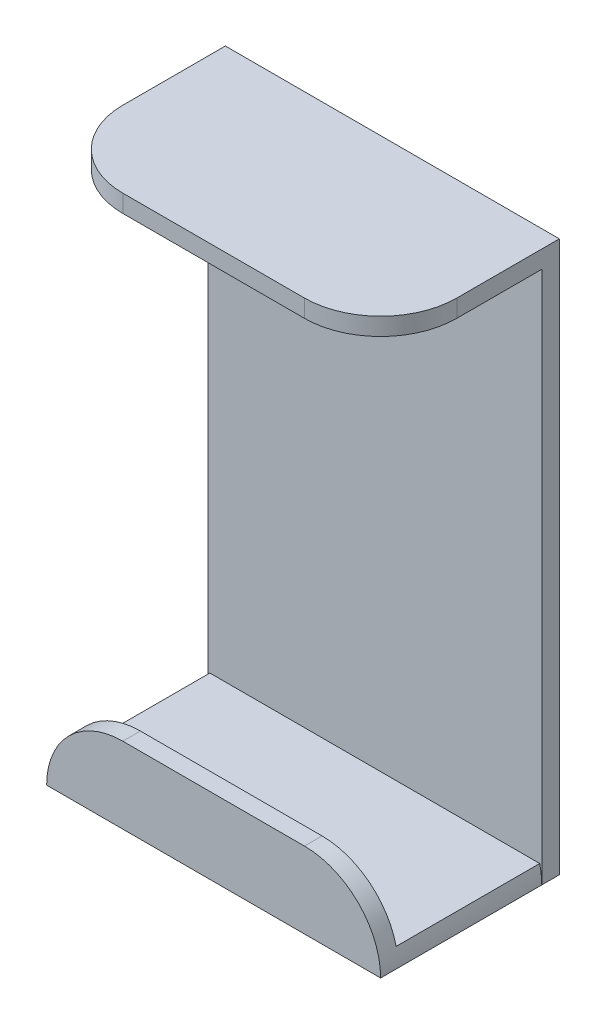
ISO-10303-21;
HEADER;
FILE_DESCRIPTION(('STEP AP214'),'2;1');
FILE_NAME('part.step','',(''),(''),'','','');
FILE_SCHEMA(('AUTOMOTIVE_DESIGN { 1 0 10303 214 1 1 1 1 }'));
ENDSEC;
DATA;
#1=APPLICATION_CONTEXT('core data for automotive mechanical design processes');
#2=APPLICATION_PROTOCOL_DEFINITION('international standard','automotive_design',2000,#1);
#3=PRODUCT_CONTEXT('',#1,'mechanical');
#4=PRODUCT('Part','Part','',(#3));
#5=PRODUCT_RELATED_PRODUCT_CATEGORY('part','',(#4));
#6=PRODUCT_DEFINITION_FORMATION('','',#4);
#7=PRODUCT_DEFINITION_CONTEXT('part definition',#1,'design');
#8=PRODUCT_DEFINITION('design','',#6,#7);
#9=PRODUCT_DEFINITION_SHAPE('','',#8);
#10=(LENGTH_UNIT() NAMED_UNIT(*) SI_UNIT(.MILLI.,.METRE.));
#11=(NAMED_UNIT(*) PLANE_ANGLE_UNIT() SI_UNIT($,.RADIAN.));
#12=(NAMED_UNIT(*) SI_UNIT($,.STERADIAN.) SOLID_ANGLE_UNIT());
#13=UNCERTAINTY_MEASURE_WITH_UNIT(LENGTH_MEASURE(1.E-05),#10,'distance_accuracy_value','');
#14=(GEOMETRIC_REPRESENTATION_CONTEXT(3) GLOBAL_UNCERTAINTY_ASSIGNED_CONTEXT((#13)) GLOBAL_UNIT_ASSIGNED_CONTEXT((#10,
#11,#12)) REPRESENTATION_CONTEXT('',''));
#15=CARTESIAN_POINT('',(0.,0.,0.));
#16=DIRECTION('',(0.,0.,1.));
#17=DIRECTION('',(1.,0.,0.));
#18=AXIS2_PLACEMENT_3D('',#15,#16,#17);
#19=CARTESIAN_POINT('',(57.,100.,0.));
#20=DIRECTION('',(0.,0.,-1.));
#21=DIRECTION('',(-1.,0.,0.));
#22=AXIS2_PLACEMENT_3D('',#19,#20,#21);
#23=PLANE('',#22);
#24=DIRECTION('',(-1.,0.,0.));
#25=VECTOR('',#24,1.);
#26=CARTESIAN_POINT('',(206.850185602154,97.,0.));
#27=LINE('',#26,#25);
#28=CARTESIAN_POINT('',(44.,97.,0.));
#29=VERTEX_POINT('',#28);
#30=CARTESIAN_POINT('',(13.,97.,0.));
#31=VERTEX_POINT('',#30);
#32=EDGE_CURVE('E191',#29,#31,#27,.T.);
#33=ORIENTED_EDGE('',*,*,#32,.T.);
#34=DIRECTION('',(0.,-1.,0.));
#35=VECTOR('',#34,1.);
#36=CARTESIAN_POINT('',(13.,100.,0.));
#37=LINE('',#36,#35);
#38=CARTESIAN_POINT('',(13.,94.,0.));
#39=VERTEX_POINT('',#38);
#40=EDGE_CURVE('E227',#31,#39,#37,.T.);
#41=ORIENTED_EDGE('',*,*,#40,.T.);
#42=DIRECTION('',(1.,0.,0.));
#43=VECTOR('',#42,1.);
#44=CARTESIAN_POINT('',(-43.,94.,0.));
#45=LINE('',#44,#43);
#46=CARTESIAN_POINT('',(44.,94.,0.));
#47=VERTEX_POINT('',#46);
#48=EDGE_CURVE('E144',#39,#47,#45,.T.);
#49=ORIENTED_EDGE('',*,*,#48,.T.);
#50=DIRECTION('',(0.,-1.,0.));
#51=VECTOR('',#50,1.);
#52=CARTESIAN_POINT('',(44.,100.,0.));
#53=LINE('',#52,#51);
#54=EDGE_CURVE('E224',#47,#29,#53,.F.);
#55=ORIENTED_EDGE('',*,*,#54,.T.);
#56=EDGE_LOOP('',(#33,#41,#49,#55));
#57=FACE_BOUND('',#56,.T.);
#58=ADVANCED_FACE('F39',(#57),#23,.F.);
#59=CARTESIAN_POINT('',(206.850185602154,97.,0.));
#60=DIRECTION('',(0.,1.,0.));
#61=DIRECTION('',(0.,0.,1.));
#62=AXIS2_PLACEMENT_3D('',#59,#60,#61);
#63=PLANE('',#62);
#64=DIRECTION('',(0.,0.,1.));
#65=VECTOR('',#64,1.);
#66=CARTESIAN_POINT('',(0.,97.,0.));
#67=LINE('',#66,#65);
#68=CARTESIAN_POINT('',(0.,97.,-30.5));
#69=VERTEX_POINT('',#68);
#70=CARTESIAN_POINT('',(0.,97.,-13.));
#71=VERTEX_POINT('',#70);
#72=EDGE_CURVE('E215',#69,#71,#67,.T.);
#73=ORIENTED_EDGE('',*,*,#72,.T.);
#74=CARTESIAN_POINT('',(13.,97.,-13.));
#75=DIRECTION('',(0.,1.,0.));
#76=DIRECTION('',(0.,0.,1.));
#77=AXIS2_PLACEMENT_3D('',#74,#75,#76);
#78=CIRCLE('',#77,13.);
#79=EDGE_CURVE('E243',#71,#31,#78,.T.);
#80=ORIENTED_EDGE('',*,*,#79,.T.);
#81=ORIENTED_EDGE('',*,*,#32,.F.);
#82=CARTESIAN_POINT('',(44.,97.,-13.));
#83=DIRECTION('',(0.,1.,0.));
#84=DIRECTION('',(0.,0.,1.));
#85=AXIS2_PLACEMENT_3D('',#82,#83,#84);
#86=CIRCLE('',#85,13.);
#87=CARTESIAN_POINT('',(57.,97.,-13.));
#88=VERTEX_POINT('',#87);
#89=EDGE_CURVE('E240',#29,#88,#86,.T.);
#90=ORIENTED_EDGE('',*,*,#89,.T.);
#91=DIRECTION('',(0.,0.,-1.));
#92=VECTOR('',#91,1.);
#93=CARTESIAN_POINT('',(57.,97.,-33.5));
#94=LINE('',#93,#92);
#95=CARTESIAN_POINT('',(57.,97.,-30.5));
#96=VERTEX_POINT('',#95);
#97=EDGE_CURVE('E203',#88,#96,#94,.T.);
#98=ORIENTED_EDGE('',*,*,#97,.T.);
#99=DIRECTION('',(-1.,0.,0.));
#100=VECTOR('',#99,1.);
#101=CARTESIAN_POINT('',(206.850185602154,97.,-30.5));
#102=LINE('',#101,#100);
#103=EDGE_CURVE('E184',#96,#69,#102,.T.);
#104=ORIENTED_EDGE('',*,*,#103,.T.);
#105=EDGE_LOOP('',(#73,#80,#81,#90,#98,#104));
#106=FACE_BOUND('',#105,.T.);
#107=ADVANCED_FACE('F318',(#106),#63,.T.);
#108=CARTESIAN_POINT('',(206.850185602154,97.,-30.5));
#109=DIRECTION('',(0.,0.,-1.));
#110=DIRECTION('',(0.,1.,0.));
#111=AXIS2_PLACEMENT_3D('',#108,#109,#110);
#112=PLANE('',#111);
#113=ORIENTED_EDGE('',*,*,#103,.F.);
#114=DIRECTION('',(0.,-1.,0.));
#115=VECTOR('',#114,1.);
#116=CARTESIAN_POINT('',(57.,100.,-30.5));
#117=LINE('',#116,#115);
#118=CARTESIAN_POINT('',(57.,3.,-30.5));
#119=VERTEX_POINT('',#118);
#120=EDGE_CURVE('E199',#96,#119,#117,.T.);
#121=ORIENTED_EDGE('',*,*,#120,.T.);
#122=DIRECTION('',(-1.,0.,0.));
#123=VECTOR('',#122,1.);
#124=CARTESIAN_POINT('',(206.850185602154,3.,-30.5));
#125=LINE('',#124,#123);
#126=CARTESIAN_POINT('',(0.,3.,-30.5));
#127=VERTEX_POINT('',#126);
#128=EDGE_CURVE('E170',#119,#127,#125,.T.);
#129=ORIENTED_EDGE('',*,*,#128,.T.);
#130=DIRECTION('',(0.,1.,0.));
#131=VECTOR('',#130,1.);
#132=CARTESIAN_POINT('',(0.,100.,-30.5));
#133=LINE('',#132,#131);
#134=EDGE_CURVE('E211',#127,#69,#133,.T.);
#135=ORIENTED_EDGE('',*,*,#134,.T.);
#136=EDGE_LOOP('',(#113,#121,#129,#135));
#137=FACE_BOUND('',#136,.T.);
#138=ADVANCED_FACE('F304',(#137),#112,.T.);
#139=CARTESIAN_POINT('',(206.850185602154,3.,-30.5));
#140=DIRECTION('',(0.,-1.,0.));
#141=DIRECTION('',(0.,0.,-1.));
#142=AXIS2_PLACEMENT_3D('',#139,#140,#141);
#143=PLANE('',#142);
#144=ORIENTED_EDGE('',*,*,#128,.F.);
#145=DIRECTION('',(0.,0.,1.));
#146=VECTOR('',#145,1.);
#147=CARTESIAN_POINT('',(57.,3.,-33.5));
#148=LINE('',#147,#146);
#149=CARTESIAN_POINT('',(57.,3.,-27.5));
#150=VERTEX_POINT('',#149);
#151=EDGE_CURVE('E196',#119,#150,#148,.T.);
#152=ORIENTED_EDGE('',*,*,#151,.T.);
#153=CARTESIAN_POINT('',(57.,3.,0.));
#154=VERTEX_POINT('',#153);
#155=EDGE_CURVE('E195',#150,#154,#148,.T.);
#156=ORIENTED_EDGE('',*,*,#155,.T.);
#157=DIRECTION('',(-1.,0.,0.));
#158=VECTOR('',#157,1.);
#159=CARTESIAN_POINT('',(206.850185602154,3.,0.));
#160=LINE('',#159,#158);
#161=CARTESIAN_POINT('',(0.,3.,0.));
#162=VERTEX_POINT('',#161);
#163=EDGE_CURVE('E180',#154,#162,#160,.T.);
#164=ORIENTED_EDGE('',*,*,#163,.T.);
#165=DIRECTION('',(0.,0.,-1.));
#166=VECTOR('',#165,1.);
#167=CARTESIAN_POINT('',(0.,3.,0.));
#168=LINE('',#167,#166);
#169=CARTESIAN_POINT('',(0.,3.,-27.5));
#170=VERTEX_POINT('',#169);
#171=EDGE_CURVE('E207',#162,#170,#168,.T.);
#172=ORIENTED_EDGE('',*,*,#171,.T.);
#173=EDGE_CURVE('E206',#170,#127,#168,.T.);
#174=ORIENTED_EDGE('',*,*,#173,.T.);
#175=EDGE_LOOP('',(#144,#152,#156,#164,#172,#174));
#176=FACE_BOUND('',#175,.T.);
#177=ADVANCED_FACE('F278',(#176),#143,.T.);
#178=ORIENTED_EDGE('',*,*,#163,.F.);
#179=CARTESIAN_POINT('',(44.,3.,0.));
#180=DIRECTION('',(0.,0.,-1.));
#181=DIRECTION('',(-1.,0.,0.));
#182=AXIS2_PLACEMENT_3D('',#179,#180,#181);
#183=CIRCLE('',#182,13.);
#184=CARTESIAN_POINT('',(44.,16.,0.));
#185=VERTEX_POINT('',#184);
#186=EDGE_CURVE('E269',#154,#185,#183,.F.);
#187=ORIENTED_EDGE('',*,*,#186,.T.);
#188=DIRECTION('',(1.,0.,0.));
#189=VECTOR('',#188,1.);
#190=CARTESIAN_POINT('',(-43.,16.,0.));
#191=LINE('',#190,#189);
#192=CARTESIAN_POINT('',(13.,16.,0.));
#193=VERTEX_POINT('',#192);
#194=EDGE_CURVE('E161',#193,#185,#191,.T.);
#195=ORIENTED_EDGE('',*,*,#194,.F.);
#196=CARTESIAN_POINT('',(13.,3.,0.));
#197=DIRECTION('',(0.,0.,-1.));
#198=DIRECTION('',(-1.,0.,0.));
#199=AXIS2_PLACEMENT_3D('',#196,#197,#198);
#200=CIRCLE('',#199,13.);
#201=EDGE_CURVE('E266',#193,#162,#200,.F.);
#202=ORIENTED_EDGE('',*,*,#201,.T.);
#203=EDGE_LOOP('',(#178,#187,#195,#202));
#204=FACE_BOUND('',#203,.T.);
#205=ADVANCED_FACE('F283',(#204),#23,.F.);
#206=CARTESIAN_POINT('',(57.,100.,-33.5));
#207=DIRECTION('',(-1.,0.,0.));
#208=DIRECTION('',(0.,0.,1.));
#209=AXIS2_PLACEMENT_3D('',#206,#207,#208);
#210=PLANE('',#209);
#211=ORIENTED_EDGE('',*,*,#97,.F.);
#212=DIRECTION('',(0.,-1.,0.));
#213=VECTOR('',#212,1.);
#214=CARTESIAN_POINT('',(57.,100.,-13.));
#215=LINE('',#214,#213);
#216=CARTESIAN_POINT('',(57.,94.,-13.));
#217=VERTEX_POINT('',#216);
#218=EDGE_CURVE('E159',#88,#217,#215,.T.);
#219=ORIENTED_EDGE('',*,*,#218,.T.);
#220=DIRECTION('',(0.,0.,1.));
#221=VECTOR('',#220,1.);
#222=CARTESIAN_POINT('',(57.,94.,0.));
#223=LINE('',#222,#221);
#224=CARTESIAN_POINT('',(57.,94.,-27.5));
#225=VERTEX_POINT('',#224);
#226=EDGE_CURVE('E139',#225,#217,#223,.T.);
#227=ORIENTED_EDGE('',*,*,#226,.F.);
#228=DIRECTION('',(0.,1.,0.));
#229=VECTOR('',#228,1.);
#230=CARTESIAN_POINT('',(57.,94.,-27.5));
#231=LINE('',#230,#229);
#232=EDGE_CURVE('E148',#150,#225,#231,.T.);
#233=ORIENTED_EDGE('',*,*,#232,.F.);
#234=ORIENTED_EDGE('',*,*,#151,.F.);
#235=ORIENTED_EDGE('',*,*,#120,.F.);
#236=EDGE_LOOP('',(#211,#219,#227,#233,#234,#235));
#237=FACE_BOUND('',#236,.T.);
#238=ADVANCED_FACE('F157',(#237),#210,.F.);
#239=CARTESIAN_POINT('',(0.,100.,0.));
#240=DIRECTION('',(1.,0.,0.));
#241=DIRECTION('',(0.,0.,-1.));
#242=AXIS2_PLACEMENT_3D('',#239,#240,#241);
#243=PLANE('',#242);
#244=DIRECTION('',(0.,0.,1.));
#245=VECTOR('',#244,1.);
#246=CARTESIAN_POINT('',(0.,94.,0.));
#247=LINE('',#246,#245);
#248=CARTESIAN_POINT('',(0.,94.,-27.5));
#249=VERTEX_POINT('',#248);
#250=CARTESIAN_POINT('',(0.,94.,-13.));
#251=VERTEX_POINT('',#250);
#252=EDGE_CURVE('E141',#249,#251,#247,.T.);
#253=ORIENTED_EDGE('',*,*,#252,.T.);
#254=DIRECTION('',(0.,-1.,0.));
#255=VECTOR('',#254,1.);
#256=CARTESIAN_POINT('',(0.,100.,-13.));
#257=LINE('',#256,#255);
#258=EDGE_CURVE('E237',#251,#71,#257,.F.);
#259=ORIENTED_EDGE('',*,*,#258,.T.);
#260=ORIENTED_EDGE('',*,*,#72,.F.);
#261=ORIENTED_EDGE('',*,*,#134,.F.);
#262=ORIENTED_EDGE('',*,*,#173,.F.);
#263=DIRECTION('',(0.,1.,0.));
#264=VECTOR('',#263,1.);
#265=CARTESIAN_POINT('',(0.,100.,-27.5));
#266=LINE('',#265,#264);
#267=EDGE_CURVE('E219',#170,#249,#266,.T.);
#268=ORIENTED_EDGE('',*,*,#267,.T.);
#269=EDGE_LOOP('',(#253,#259,#260,#261,#262,#268));
#270=FACE_BOUND('',#269,.T.);
#271=ADVANCED_FACE('F301',(#270),#243,.F.);
#272=CARTESIAN_POINT('',(-43.,94.,0.));
#273=DIRECTION('',(0.,1.,0.));
#274=DIRECTION('',(0.,0.,1.));
#275=AXIS2_PLACEMENT_3D('',#272,#273,#274);
#276=PLANE('',#275);
#277=ORIENTED_EDGE('',*,*,#48,.F.);
#278=CARTESIAN_POINT('',(13.,94.,-13.));
#279=DIRECTION('',(0.,1.,0.));
#280=DIRECTION('',(0.,0.,1.));
#281=AXIS2_PLACEMENT_3D('',#278,#279,#280);
#282=CIRCLE('',#281,13.);
#283=EDGE_CURVE('E234',#39,#251,#282,.F.);
#284=ORIENTED_EDGE('',*,*,#283,.T.);
#285=ORIENTED_EDGE('',*,*,#252,.F.);
#286=DIRECTION('',(1.,0.,0.));
#287=VECTOR('',#286,1.);
#288=CARTESIAN_POINT('',(-43.,94.,-27.5));
#289=LINE('',#288,#287);
#290=EDGE_CURVE('E134',#249,#225,#289,.T.);
#291=ORIENTED_EDGE('',*,*,#290,.T.);
#292=ORIENTED_EDGE('',*,*,#226,.T.);
#293=CARTESIAN_POINT('',(44.,94.,-13.));
#294=DIRECTION('',(0.,1.,0.));
#295=DIRECTION('',(0.,0.,1.));
#296=AXIS2_PLACEMENT_3D('',#293,#294,#295);
#297=CIRCLE('',#296,13.);
#298=EDGE_CURVE('E231',#217,#47,#297,.F.);
#299=ORIENTED_EDGE('',*,*,#298,.T.);
#300=EDGE_LOOP('',(#277,#284,#285,#291,#292,#299));
#301=FACE_BOUND('',#300,.T.);
#302=ADVANCED_FACE('F137',(#301),#276,.F.);
#303=CARTESIAN_POINT('',(-43.,94.,-27.5));
#304=DIRECTION('',(0.,0.,-1.));
#305=DIRECTION('',(0.,1.,0.));
#306=AXIS2_PLACEMENT_3D('',#303,#304,#305);
#307=PLANE('',#306);
#308=ORIENTED_EDGE('',*,*,#267,.F.);
#309=CARTESIAN_POINT('',(13.,3.,-27.5));
#310=DIRECTION('',(0.,0.,-1.));
#311=DIRECTION('',(0.,1.,0.));
#312=AXIS2_PLACEMENT_3D('',#309,#310,#311);
#313=CIRCLE('',#312,13.);
#314=CARTESIAN_POINT('',(0.350889359326478,6.,-27.5));
#315=VERTEX_POINT('',#314);
#316=EDGE_CURVE('E11',#170,#315,#313,.T.);
#317=ORIENTED_EDGE('',*,*,#316,.T.);
#318=DIRECTION('',(1.,0.,0.));
#319=VECTOR('',#318,1.);
#320=CARTESIAN_POINT('',(-43.,6.,-27.5));
#321=LINE('',#320,#319);
#322=CARTESIAN_POINT('',(56.6491106406735,6.,-27.5));
#323=VERTEX_POINT('',#322);
#324=EDGE_CURVE('E145',#315,#323,#321,.T.);
#325=ORIENTED_EDGE('',*,*,#324,.T.);
#326=CARTESIAN_POINT('',(44.,3.,-27.5));
#327=DIRECTION('',(0.,0.,-1.));
#328=DIRECTION('',(0.,1.,0.));
#329=AXIS2_PLACEMENT_3D('',#326,#327,#328);
#330=CIRCLE('',#329,13.);
#331=EDGE_CURVE('E48',#323,#150,#330,.T.);
#332=ORIENTED_EDGE('',*,*,#331,.T.);
#333=ORIENTED_EDGE('',*,*,#232,.T.);
#334=ORIENTED_EDGE('',*,*,#290,.F.);
#335=EDGE_LOOP('',(#308,#317,#325,#332,#333,#334));
#336=FACE_BOUND('',#335,.T.);
#337=ADVANCED_FACE('F149',(#336),#307,.F.);
#338=CARTESIAN_POINT('',(-43.,6.,-27.5));
#339=DIRECTION('',(0.,-1.,0.));
#340=DIRECTION('',(0.,0.,-1.));
#341=AXIS2_PLACEMENT_3D('',#338,#339,#340);
#342=PLANE('',#341);
#343=DIRECTION('',(1.,0.,0.));
#344=VECTOR('',#343,1.);
#345=CARTESIAN_POINT('',(-43.,6.00000000000001,-3.));
#346=LINE('',#345,#344);
#347=CARTESIAN_POINT('',(0.350889359326482,6.00000000000001,-3.));
#348=VERTEX_POINT('',#347);
#349=CARTESIAN_POINT('',(56.6491106406735,6.00000000000001,-3.));
#350=VERTEX_POINT('',#349);
#351=EDGE_CURVE('E174',#348,#350,#346,.T.);
#352=ORIENTED_EDGE('',*,*,#351,.T.);
#353=DIRECTION('',(0.,0.,-1.));
#354=VECTOR('',#353,1.);
#355=CARTESIAN_POINT('',(56.6491106406735,6.00000000000001,-3.));
#356=LINE('',#355,#354);
#357=EDGE_CURVE('E55',#350,#323,#356,.T.);
#358=ORIENTED_EDGE('',*,*,#357,.T.);
#359=ORIENTED_EDGE('',*,*,#324,.F.);
#360=DIRECTION('',(0.,0.,-1.));
#361=VECTOR('',#360,1.);
#362=CARTESIAN_POINT('',(0.35088935932648,6.,-27.5));
#363=LINE('',#362,#361);
#364=EDGE_CURVE('E261',#315,#348,#363,.F.);
#365=ORIENTED_EDGE('',*,*,#364,.T.);
#366=EDGE_LOOP('',(#352,#358,#359,#365));
#367=FACE_BOUND('',#366,.T.);
#368=ADVANCED_FACE('F376',(#367),#342,.F.);
#369=CARTESIAN_POINT('',(-43.,6.00000000000001,-3.));
#370=DIRECTION('',(0.,0.,1.));
#371=DIRECTION('',(1.,0.,0.));
#372=AXIS2_PLACEMENT_3D('',#369,#370,#371);
#373=PLANE('',#372);
#374=DIRECTION('',(1.,0.,0.));
#375=VECTOR('',#374,1.);
#376=CARTESIAN_POINT('',(-43.,16.,-3.));
#377=LINE('',#376,#375);
#378=CARTESIAN_POINT('',(13.,16.,-3.));
#379=VERTEX_POINT('',#378);
#380=CARTESIAN_POINT('',(44.,16.,-3.));
#381=VERTEX_POINT('',#380);
#382=EDGE_CURVE('E165',#379,#381,#377,.T.);
#383=ORIENTED_EDGE('',*,*,#382,.T.);
#384=CARTESIAN_POINT('',(44.,3.,-3.));
#385=DIRECTION('',(0.,0.,1.));
#386=DIRECTION('',(1.,0.,0.));
#387=AXIS2_PLACEMENT_3D('',#384,#385,#386);
#388=CIRCLE('',#387,13.);
#389=EDGE_CURVE('E258',#381,#350,#388,.F.);
#390=ORIENTED_EDGE('',*,*,#389,.T.);
#391=ORIENTED_EDGE('',*,*,#351,.F.);
#392=CARTESIAN_POINT('',(13.,3.,-3.));
#393=DIRECTION('',(0.,0.,1.));
#394=DIRECTION('',(1.,0.,0.));
#395=AXIS2_PLACEMENT_3D('',#392,#393,#394);
#396=CIRCLE('',#395,13.);
#397=EDGE_CURVE('E255',#348,#379,#396,.F.);
#398=ORIENTED_EDGE('',*,*,#397,.T.);
#399=EDGE_LOOP('',(#383,#390,#391,#398));
#400=FACE_BOUND('',#399,.T.);
#401=ADVANCED_FACE('F293',(#400),#373,.F.);
#402=CARTESIAN_POINT('',(-43.,16.,-3.));
#403=DIRECTION('',(0.,-1.,0.));
#404=DIRECTION('',(0.,0.,-1.));
#405=AXIS2_PLACEMENT_3D('',#402,#403,#404);
#406=PLANE('',#405);
#407=ORIENTED_EDGE('',*,*,#194,.T.);
#408=DIRECTION('',(0.,0.,-1.));
#409=VECTOR('',#408,1.);
#410=CARTESIAN_POINT('',(44.,16.,-3.));
#411=LINE('',#410,#409);
#412=EDGE_CURVE('E251',#185,#381,#411,.T.);
#413=ORIENTED_EDGE('',*,*,#412,.T.);
#414=ORIENTED_EDGE('',*,*,#382,.F.);
#415=DIRECTION('',(0.,0.,-1.));
#416=VECTOR('',#415,1.);
#417=CARTESIAN_POINT('',(13.,16.,-3.));
#418=LINE('',#417,#416);
#419=EDGE_CURVE('E248',#379,#193,#418,.F.);
#420=ORIENTED_EDGE('',*,*,#419,.T.);
#421=EDGE_LOOP('',(#407,#413,#414,#420));
#422=FACE_BOUND('',#421,.T.);
#423=ADVANCED_FACE('F290',(#422),#406,.F.);
#424=CARTESIAN_POINT('',(13.,100.,-13.));
#425=DIRECTION('',(0.,-1.,0.));
#426=DIRECTION('',(0.,0.,-1.));
#427=AXIS2_PLACEMENT_3D('',#424,#425,#426);
#428=CYLINDRICAL_SURFACE('',#427,13.);
#429=ORIENTED_EDGE('',*,*,#79,.F.);
#430=ORIENTED_EDGE('',*,*,#258,.F.);
#431=ORIENTED_EDGE('',*,*,#283,.F.);
#432=ORIENTED_EDGE('',*,*,#40,.F.);
#433=EDGE_LOOP('',(#429,#430,#431,#432));
#434=FACE_BOUND('',#433,.T.);
#435=ADVANCED_FACE('F316',(#434),#428,.T.);
#436=CARTESIAN_POINT('',(44.,100.,-13.));
#437=DIRECTION('',(0.,-1.,0.));
#438=DIRECTION('',(0.,0.,-1.));
#439=AXIS2_PLACEMENT_3D('',#436,#437,#438);
#440=CYLINDRICAL_SURFACE('',#439,13.);
#441=ORIENTED_EDGE('',*,*,#89,.F.);
#442=ORIENTED_EDGE('',*,*,#54,.F.);
#443=ORIENTED_EDGE('',*,*,#298,.F.);
#444=ORIENTED_EDGE('',*,*,#218,.F.);
#445=EDGE_LOOP('',(#441,#442,#443,#444));
#446=FACE_BOUND('',#445,.T.);
#447=ADVANCED_FACE('F309',(#446),#440,.T.);
#448=CARTESIAN_POINT('',(44.,3.,-3.));
#449=DIRECTION('',(0.,0.,-1.));
#450=DIRECTION('',(-1.,0.,0.));
#451=AXIS2_PLACEMENT_3D('',#448,#449,#450);
#452=CYLINDRICAL_SURFACE('',#451,13.);
#453=ORIENTED_EDGE('',*,*,#186,.F.);
#454=ORIENTED_EDGE('',*,*,#155,.F.);
#455=ORIENTED_EDGE('',*,*,#331,.F.);
#456=ORIENTED_EDGE('',*,*,#357,.F.);
#457=ORIENTED_EDGE('',*,*,#389,.F.);
#458=ORIENTED_EDGE('',*,*,#412,.F.);
#459=EDGE_LOOP('',(#453,#454,#455,#456,#457,#458));
#460=FACE_BOUND('',#459,.T.);
#461=ADVANCED_FACE('F287',(#460),#452,.T.);
#462=CARTESIAN_POINT('',(13.,3.,0.));
#463=DIRECTION('',(0.,0.,-1.));
#464=DIRECTION('',(-1.,0.,0.));
#465=AXIS2_PLACEMENT_3D('',#462,#463,#464);
#466=CYLINDRICAL_SURFACE('',#465,13.);
#467=ORIENTED_EDGE('',*,*,#201,.F.);
#468=ORIENTED_EDGE('',*,*,#419,.F.);
#469=ORIENTED_EDGE('',*,*,#397,.F.);
#470=ORIENTED_EDGE('',*,*,#364,.F.);
#471=ORIENTED_EDGE('',*,*,#316,.F.);
#472=ORIENTED_EDGE('',*,*,#171,.F.);
#473=EDGE_LOOP('',(#467,#468,#469,#470,#471,#472));
#474=FACE_BOUND('',#473,.T.);
#475=ADVANCED_FACE('F41',(#474),#466,.T.);
#476=CLOSED_SHELL('',(#58,#107,#138,#177,#205,#238,#271,#302,#337,#368,#401,#423,#435,#447,#461,#475));
#477=MANIFOLD_SOLID_BREP('B2',#476);
#478=ADVANCED_BREP_SHAPE_REPRESENTATION('',(#18,#477),#14);
#479=SHAPE_DEFINITION_REPRESENTATION(#9,#478);
ENDSEC;
END-ISO-10303-21;
